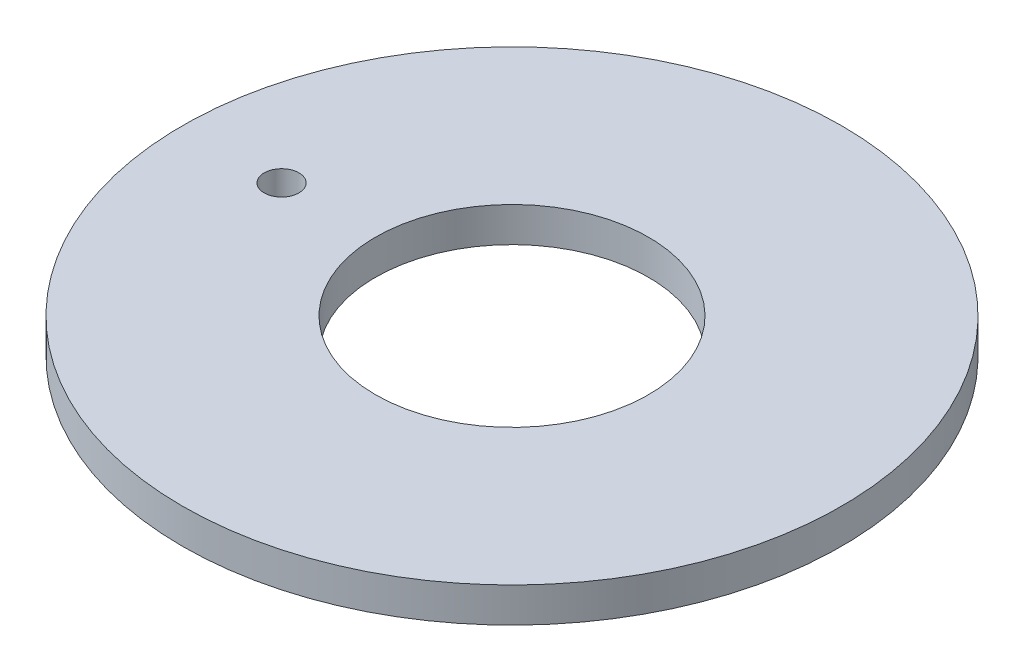
ISO-10303-21;
HEADER;
FILE_DESCRIPTION(('STEP AP214'),'2;1');
FILE_NAME('part.step','',(''),(''),'','','');
FILE_SCHEMA(('AUTOMOTIVE_DESIGN { 1 0 10303 214 1 1 1 1 }'));
ENDSEC;
DATA;
#1=APPLICATION_CONTEXT('core data for automotive mechanical design processes');
#2=APPLICATION_PROTOCOL_DEFINITION('international standard','automotive_design',2000,#1);
#3=PRODUCT_CONTEXT('',#1,'mechanical');
#4=PRODUCT('Part','Part','',(#3));
#5=PRODUCT_RELATED_PRODUCT_CATEGORY('part','',(#4));
#6=PRODUCT_DEFINITION_FORMATION('','',#4);
#7=PRODUCT_DEFINITION_CONTEXT('part definition',#1,'design');
#8=PRODUCT_DEFINITION('design','',#6,#7);
#9=PRODUCT_DEFINITION_SHAPE('','',#8);
#10=(LENGTH_UNIT() NAMED_UNIT(*) SI_UNIT(.MILLI.,.METRE.));
#11=(NAMED_UNIT(*) PLANE_ANGLE_UNIT() SI_UNIT($,.RADIAN.));
#12=(NAMED_UNIT(*) SI_UNIT($,.STERADIAN.) SOLID_ANGLE_UNIT());
#13=UNCERTAINTY_MEASURE_WITH_UNIT(LENGTH_MEASURE(1.E-05),#10,'distance_accuracy_value','');
#14=(GEOMETRIC_REPRESENTATION_CONTEXT(3) GLOBAL_UNCERTAINTY_ASSIGNED_CONTEXT((#13)) GLOBAL_UNIT_ASSIGNED_CONTEXT((#10,
#11,#12)) REPRESENTATION_CONTEXT('',''));
#15=CARTESIAN_POINT('',(0.,0.,0.));
#16=DIRECTION('',(0.,0.,1.));
#17=DIRECTION('',(1.,0.,0.));
#18=AXIS2_PLACEMENT_3D('',#15,#16,#17);
#19=CARTESIAN_POINT('',(0.,4.,0.));
#20=DIRECTION('',(0.,1.,0.));
#21=DIRECTION('',(0.,0.,1.));
#22=AXIS2_PLACEMENT_3D('',#19,#20,#21);
#23=PLANE('',#22);
#24=CARTESIAN_POINT('',(-26.5,4.,0.));
#25=DIRECTION('',(0.,1.,0.));
#26=DIRECTION('',(0.,0.,1.));
#27=AXIS2_PLACEMENT_3D('',#24,#25,#26);
#28=CIRCLE('',#27,2.);
#29=CARTESIAN_POINT('',(-26.5,4.,2.));
#30=VERTEX_POINT('',#29);
#31=EDGE_CURVE('E52',#30,#30,#28,.T.);
#32=ORIENTED_EDGE('',*,*,#31,.F.);
#33=EDGE_LOOP('',(#32));
#34=FACE_BOUND('',#33,.T.);
#35=CARTESIAN_POINT('',(0.,4.,0.));
#36=DIRECTION('',(0.,1.,0.));
#37=DIRECTION('',(0.,0.,1.));
#38=AXIS2_PLACEMENT_3D('',#35,#36,#37);
#39=CIRCLE('',#38,37.9);
#40=CARTESIAN_POINT('',(0.,4.,37.9));
#41=VERTEX_POINT('',#40);
#42=EDGE_CURVE('E10',#41,#41,#39,.T.);
#43=ORIENTED_EDGE('',*,*,#42,.T.);
#44=EDGE_LOOP('',(#43));
#45=FACE_BOUND('',#44,.T.);
#46=CARTESIAN_POINT('',(0.,4.,0.));
#47=DIRECTION('',(0.,1.,0.));
#48=DIRECTION('',(0.,0.,1.));
#49=AXIS2_PLACEMENT_3D('',#46,#47,#48);
#50=CIRCLE('',#49,15.7);
#51=CARTESIAN_POINT('',(0.,4.,15.7));
#52=VERTEX_POINT('',#51);
#53=EDGE_CURVE('E44',#52,#52,#50,.T.);
#54=ORIENTED_EDGE('',*,*,#53,.F.);
#55=EDGE_LOOP('',(#54));
#56=FACE_BOUND('',#55,.T.);
#57=ADVANCED_FACE('F33',(#34,#45,#56),#23,.T.);
#58=CARTESIAN_POINT('',(0.,0.,0.));
#59=DIRECTION('',(0.,1.,0.));
#60=DIRECTION('',(0.,0.,1.));
#61=AXIS2_PLACEMENT_3D('',#58,#59,#60);
#62=PLANE('',#61);
#63=CARTESIAN_POINT('',(-26.5,0.,0.));
#64=DIRECTION('',(0.,1.,0.));
#65=DIRECTION('',(0.,0.,1.));
#66=AXIS2_PLACEMENT_3D('',#63,#64,#65);
#67=CIRCLE('',#66,2.);
#68=CARTESIAN_POINT('',(-26.5,0.,2.));
#69=VERTEX_POINT('',#68);
#70=EDGE_CURVE('E49',#69,#69,#67,.T.);
#71=ORIENTED_EDGE('',*,*,#70,.T.);
#72=EDGE_LOOP('',(#71));
#73=FACE_BOUND('',#72,.T.);
#74=CARTESIAN_POINT('',(0.,0.,0.));
#75=DIRECTION('',(0.,1.,0.));
#76=DIRECTION('',(0.,0.,1.));
#77=AXIS2_PLACEMENT_3D('',#74,#75,#76);
#78=CIRCLE('',#77,37.9);
#79=CARTESIAN_POINT('',(0.,0.,37.9));
#80=VERTEX_POINT('',#79);
#81=EDGE_CURVE('E37',#80,#80,#78,.T.);
#82=ORIENTED_EDGE('',*,*,#81,.F.);
#83=EDGE_LOOP('',(#82));
#84=FACE_BOUND('',#83,.T.);
#85=CARTESIAN_POINT('',(0.,0.,0.));
#86=DIRECTION('',(0.,1.,0.));
#87=DIRECTION('',(0.,0.,1.));
#88=AXIS2_PLACEMENT_3D('',#85,#86,#87);
#89=CIRCLE('',#88,15.7);
#90=CARTESIAN_POINT('',(0.,0.,15.7));
#91=VERTEX_POINT('',#90);
#92=EDGE_CURVE('E46',#91,#91,#89,.T.);
#93=ORIENTED_EDGE('',*,*,#92,.T.);
#94=EDGE_LOOP('',(#93));
#95=FACE_BOUND('',#94,.T.);
#96=ADVANCED_FACE('F58',(#73,#84,#95),#62,.F.);
#97=CARTESIAN_POINT('',(0.,4.,0.));
#98=DIRECTION('',(0.,-1.,0.));
#99=DIRECTION('',(0.,0.,-1.));
#100=AXIS2_PLACEMENT_3D('',#97,#98,#99);
#101=CYLINDRICAL_SURFACE('',#100,37.9);
#102=ORIENTED_EDGE('',*,*,#42,.F.);
#103=EDGE_LOOP('',(#102));
#104=FACE_BOUND('',#103,.T.);
#105=ORIENTED_EDGE('',*,*,#81,.T.);
#106=EDGE_LOOP('',(#105));
#107=FACE_BOUND('',#106,.T.);
#108=ADVANCED_FACE('F35',(#104,#107),#101,.T.);
#109=CARTESIAN_POINT('',(0.,4.,0.));
#110=DIRECTION('',(0.,-1.,0.));
#111=DIRECTION('',(0.,0.,-1.));
#112=AXIS2_PLACEMENT_3D('',#109,#110,#111);
#113=CYLINDRICAL_SURFACE('',#112,15.7);
#114=ORIENTED_EDGE('',*,*,#53,.T.);
#115=EDGE_LOOP('',(#114));
#116=FACE_BOUND('',#115,.T.);
#117=ORIENTED_EDGE('',*,*,#92,.F.);
#118=EDGE_LOOP('',(#117));
#119=FACE_BOUND('',#118,.T.);
#120=ADVANCED_FACE('F64',(#116,#119),#113,.F.);
#121=CARTESIAN_POINT('',(-26.5,0.,0.));
#122=DIRECTION('',(0.,1.,0.));
#123=DIRECTION('',(0.,0.,1.));
#124=AXIS2_PLACEMENT_3D('',#121,#122,#123);
#125=CYLINDRICAL_SURFACE('',#124,2.);
#126=ORIENTED_EDGE('',*,*,#70,.F.);
#127=EDGE_LOOP('',(#126));
#128=FACE_BOUND('',#127,.T.);
#129=ORIENTED_EDGE('',*,*,#31,.T.);
#130=EDGE_LOOP('',(#129));
#131=FACE_BOUND('',#130,.T.);
#132=ADVANCED_FACE('F61',(#128,#131),#125,.F.);
#133=CLOSED_SHELL('',(#57,#96,#108,#120,#132));
#134=MANIFOLD_SOLID_BREP('B2',#133);
#135=ADVANCED_BREP_SHAPE_REPRESENTATION('',(#18,#134),#14);
#136=SHAPE_DEFINITION_REPRESENTATION(#9,#135);
ENDSEC;
END-ISO-10303-21;
